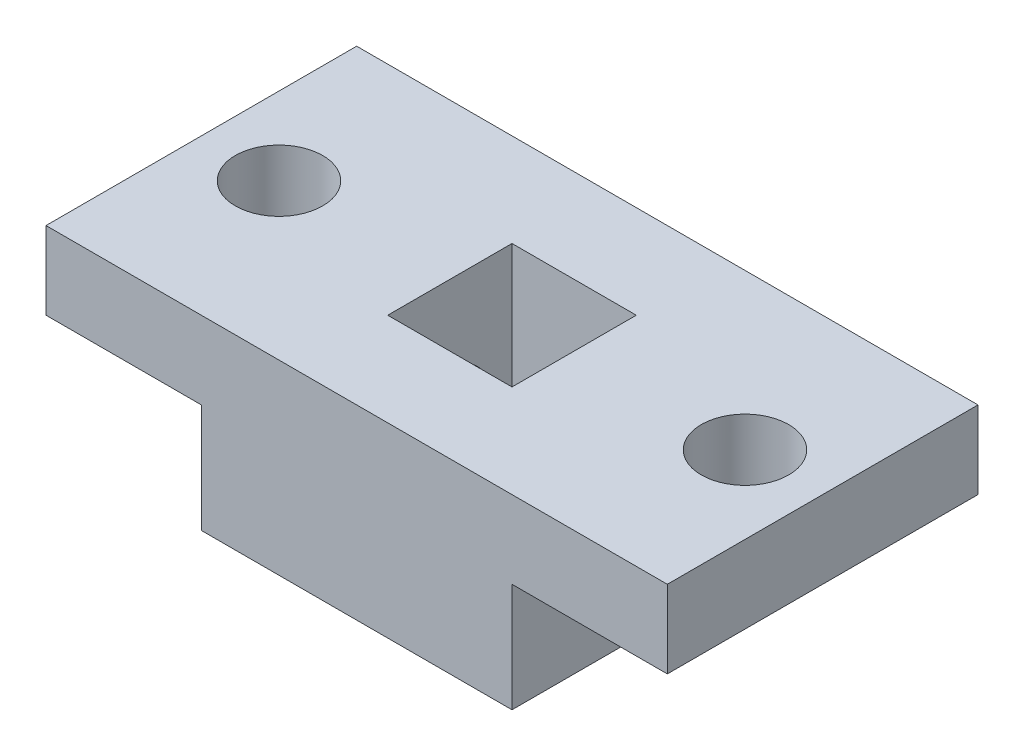
ISO-10303-21;
HEADER;
FILE_DESCRIPTION(('STEP AP214'),'2;1');
FILE_NAME('part.step','',(''),(''),'','','');
FILE_SCHEMA(('AUTOMOTIVE_DESIGN { 1 0 10303 214 1 1 1 1 }'));
ENDSEC;
DATA;
#1=APPLICATION_CONTEXT('core data for automotive mechanical design processes');
#2=APPLICATION_PROTOCOL_DEFINITION('international standard','automotive_design',2000,#1);
#3=PRODUCT_CONTEXT('',#1,'mechanical');
#4=PRODUCT('Part','Part','',(#3));
#5=PRODUCT_RELATED_PRODUCT_CATEGORY('part','',(#4));
#6=PRODUCT_DEFINITION_FORMATION('','',#4);
#7=PRODUCT_DEFINITION_CONTEXT('part definition',#1,'design');
#8=PRODUCT_DEFINITION('design','',#6,#7);
#9=PRODUCT_DEFINITION_SHAPE('','',#8);
#10=(LENGTH_UNIT() NAMED_UNIT(*) SI_UNIT(.MILLI.,.METRE.));
#11=(NAMED_UNIT(*) PLANE_ANGLE_UNIT() SI_UNIT($,.RADIAN.));
#12=(NAMED_UNIT(*) SI_UNIT($,.STERADIAN.) SOLID_ANGLE_UNIT());
#13=UNCERTAINTY_MEASURE_WITH_UNIT(LENGTH_MEASURE(1.E-05),#10,'distance_accuracy_value','');
#14=(GEOMETRIC_REPRESENTATION_CONTEXT(3) GLOBAL_UNCERTAINTY_ASSIGNED_CONTEXT((#13)) GLOBAL_UNIT_ASSIGNED_CONTEXT((#10,
#11,#12)) REPRESENTATION_CONTEXT('',''));
#15=CARTESIAN_POINT('',(0.,0.,0.));
#16=DIRECTION('',(0.,0.,1.));
#17=DIRECTION('',(1.,0.,0.));
#18=AXIS2_PLACEMENT_3D('',#15,#16,#17);
#19=CARTESIAN_POINT('',(6.35,0.,12.7));
#20=DIRECTION('',(0.,-1.,0.));
#21=DIRECTION('',(1.,0.,0.));
#22=AXIS2_PLACEMENT_3D('',#19,#20,#21);
#23=PLANE('',#22);
#24=DIRECTION('',(-1.,0.,0.));
#25=VECTOR('',#24,1.);
#26=CARTESIAN_POINT('',(6.35,0.,0.));
#27=LINE('',#26,#25);
#28=CARTESIAN_POINT('',(6.35,0.,0.));
#29=VERTEX_POINT('',#28);
#30=CARTESIAN_POINT('',(-6.35,0.,0.));
#31=VERTEX_POINT('',#30);
#32=EDGE_CURVE('E211',#29,#31,#27,.T.);
#33=ORIENTED_EDGE('',*,*,#32,.F.);
#34=DIRECTION('',(0.,0.,-1.));
#35=VECTOR('',#34,1.);
#36=CARTESIAN_POINT('',(6.35,0.,12.7));
#37=LINE('',#36,#35);
#38=CARTESIAN_POINT('',(6.35,0.,12.7));
#39=VERTEX_POINT('',#38);
#40=EDGE_CURVE('E12',#39,#29,#37,.T.);
#41=ORIENTED_EDGE('',*,*,#40,.F.);
#42=DIRECTION('',(-1.,0.,0.));
#43=VECTOR('',#42,1.);
#44=CARTESIAN_POINT('',(6.35,0.,12.7));
#45=LINE('',#44,#43);
#46=CARTESIAN_POINT('',(-6.35,0.,12.7));
#47=VERTEX_POINT('',#46);
#48=EDGE_CURVE('E224',#39,#47,#45,.T.);
#49=ORIENTED_EDGE('',*,*,#48,.T.);
#50=DIRECTION('',(0.,0.,-1.));
#51=VECTOR('',#50,1.);
#52=CARTESIAN_POINT('',(-6.35,0.,12.7));
#53=LINE('',#52,#51);
#54=EDGE_CURVE('E207',#47,#31,#53,.T.);
#55=ORIENTED_EDGE('',*,*,#54,.T.);
#56=EDGE_LOOP('',(#33,#41,#49,#55));
#57=FACE_BOUND('',#56,.T.);
#58=ADVANCED_FACE('F41',(#57),#23,.T.);
#59=CARTESIAN_POINT('',(6.35,4.445,12.7));
#60=DIRECTION('',(1.,0.,0.));
#61=DIRECTION('',(0.,1.,0.));
#62=AXIS2_PLACEMENT_3D('',#59,#60,#61);
#63=PLANE('',#62);
#64=DIRECTION('',(0.,-1.,0.));
#65=VECTOR('',#64,1.);
#66=CARTESIAN_POINT('',(6.35,4.445,0.));
#67=LINE('',#66,#65);
#68=CARTESIAN_POINT('',(6.35,4.445,0.));
#69=VERTEX_POINT('',#68);
#70=EDGE_CURVE('E228',#69,#29,#67,.T.);
#71=ORIENTED_EDGE('',*,*,#70,.F.);
#72=DIRECTION('',(0.,0.,-1.));
#73=VECTOR('',#72,1.);
#74=CARTESIAN_POINT('',(6.35,4.445,12.7));
#75=LINE('',#74,#73);
#76=CARTESIAN_POINT('',(6.35,4.445,12.7));
#77=VERTEX_POINT('',#76);
#78=EDGE_CURVE('E50',#77,#69,#75,.T.);
#79=ORIENTED_EDGE('',*,*,#78,.F.);
#80=DIRECTION('',(0.,-1.,0.));
#81=VECTOR('',#80,1.);
#82=CARTESIAN_POINT('',(6.35,4.445,12.7));
#83=LINE('',#82,#81);
#84=EDGE_CURVE('E240',#77,#39,#83,.T.);
#85=ORIENTED_EDGE('',*,*,#84,.T.);
#86=ORIENTED_EDGE('',*,*,#40,.T.);
#87=EDGE_LOOP('',(#71,#79,#85,#86));
#88=FACE_BOUND('',#87,.T.);
#89=ADVANCED_FACE('F298',(#88),#63,.T.);
#90=CARTESIAN_POINT('',(12.7,4.445,12.7));
#91=DIRECTION('',(0.,-1.,0.));
#92=DIRECTION('',(1.,0.,0.));
#93=AXIS2_PLACEMENT_3D('',#90,#91,#92);
#94=PLANE('',#93);
#95=CARTESIAN_POINT('',(9.525,4.445,6.35));
#96=DIRECTION('',(0.,-1.,0.));
#97=DIRECTION('',(1.,0.,0.));
#98=AXIS2_PLACEMENT_3D('',#95,#96,#97);
#99=CIRCLE('',#98,1.7859375);
#100=CARTESIAN_POINT('',(11.3109375,4.445,6.35));
#101=VERTEX_POINT('',#100);
#102=EDGE_CURVE('E320',#101,#101,#99,.T.);
#103=ORIENTED_EDGE('',*,*,#102,.F.);
#104=EDGE_LOOP('',(#103));
#105=FACE_BOUND('',#104,.T.);
#106=DIRECTION('',(-1.,0.,0.));
#107=VECTOR('',#106,1.);
#108=CARTESIAN_POINT('',(12.7,4.445,0.));
#109=LINE('',#108,#107);
#110=CARTESIAN_POINT('',(12.7,4.445,0.));
#111=VERTEX_POINT('',#110);
#112=EDGE_CURVE('E254',#111,#69,#109,.T.);
#113=ORIENTED_EDGE('',*,*,#112,.F.);
#114=DIRECTION('',(0.,0.,-1.));
#115=VECTOR('',#114,1.);
#116=CARTESIAN_POINT('',(12.7,4.445,12.7));
#117=LINE('',#116,#115);
#118=CARTESIAN_POINT('',(12.7,4.445,12.7));
#119=VERTEX_POINT('',#118);
#120=EDGE_CURVE('E262',#119,#111,#117,.T.);
#121=ORIENTED_EDGE('',*,*,#120,.F.);
#122=DIRECTION('',(-1.,0.,0.));
#123=VECTOR('',#122,1.);
#124=CARTESIAN_POINT('',(12.7,4.445,12.7));
#125=LINE('',#124,#123);
#126=EDGE_CURVE('E236',#119,#77,#125,.T.);
#127=ORIENTED_EDGE('',*,*,#126,.T.);
#128=ORIENTED_EDGE('',*,*,#78,.T.);
#129=EDGE_LOOP('',(#113,#121,#127,#128));
#130=FACE_BOUND('',#129,.T.);
#131=ADVANCED_FACE('F295',(#105,#130),#94,.T.);
#132=CARTESIAN_POINT('',(12.7,7.62,12.7));
#133=DIRECTION('',(1.,0.,0.));
#134=DIRECTION('',(0.,0.,-1.));
#135=AXIS2_PLACEMENT_3D('',#132,#133,#134);
#136=PLANE('',#135);
#137=DIRECTION('',(0.,-1.,0.));
#138=VECTOR('',#137,1.);
#139=CARTESIAN_POINT('',(12.7,7.62,0.));
#140=LINE('',#139,#138);
#141=CARTESIAN_POINT('',(12.7,7.62,0.));
#142=VERTEX_POINT('',#141);
#143=EDGE_CURVE('E250',#142,#111,#140,.T.);
#144=ORIENTED_EDGE('',*,*,#143,.F.);
#145=DIRECTION('',(0.,0.,-1.));
#146=VECTOR('',#145,1.);
#147=CARTESIAN_POINT('',(12.7,7.62,12.7));
#148=LINE('',#147,#146);
#149=CARTESIAN_POINT('',(12.7,7.62,12.7));
#150=VERTEX_POINT('',#149);
#151=EDGE_CURVE('E44',#150,#142,#148,.T.);
#152=ORIENTED_EDGE('',*,*,#151,.F.);
#153=DIRECTION('',(0.,-1.,0.));
#154=VECTOR('',#153,1.);
#155=CARTESIAN_POINT('',(12.7,7.62,12.7));
#156=LINE('',#155,#154);
#157=EDGE_CURVE('E232',#150,#119,#156,.T.);
#158=ORIENTED_EDGE('',*,*,#157,.T.);
#159=ORIENTED_EDGE('',*,*,#120,.T.);
#160=EDGE_LOOP('',(#144,#152,#158,#159));
#161=FACE_BOUND('',#160,.T.);
#162=ADVANCED_FACE('F272',(#161),#136,.T.);
#163=CARTESIAN_POINT('',(0.,7.62,12.7));
#164=DIRECTION('',(0.,1.,0.));
#165=DIRECTION('',(0.,0.,1.));
#166=AXIS2_PLACEMENT_3D('',#163,#164,#165);
#167=PLANE('',#166);
#168=CARTESIAN_POINT('',(9.525,7.62,6.35));
#169=DIRECTION('',(0.,1.,0.));
#170=DIRECTION('',(0.,0.,1.));
#171=AXIS2_PLACEMENT_3D('',#168,#169,#170);
#172=CIRCLE('',#171,1.7859375);
#173=CARTESIAN_POINT('',(9.525,7.62,8.1359375));
#174=VERTEX_POINT('',#173);
#175=EDGE_CURVE('E333',#174,#174,#172,.F.);
#176=ORIENTED_EDGE('',*,*,#175,.T.);
#177=EDGE_LOOP('',(#176));
#178=FACE_BOUND('',#177,.T.);
#179=CARTESIAN_POINT('',(-9.525,7.62,6.35));
#180=DIRECTION('',(0.,1.,0.));
#181=DIRECTION('',(0.,0.,1.));
#182=AXIS2_PLACEMENT_3D('',#179,#180,#181);
#183=CIRCLE('',#182,1.7859375);
#184=CARTESIAN_POINT('',(-9.525,7.62,8.1359375));
#185=VERTEX_POINT('',#184);
#186=EDGE_CURVE('E325',#185,#185,#183,.F.);
#187=ORIENTED_EDGE('',*,*,#186,.T.);
#188=EDGE_LOOP('',(#187));
#189=FACE_BOUND('',#188,.T.);
#190=DIRECTION('',(0.,0.,-1.));
#191=VECTOR('',#190,1.);
#192=CARTESIAN_POINT('',(2.54,7.62,8.89));
#193=LINE('',#192,#191);
#194=CARTESIAN_POINT('',(2.54,7.62,8.89));
#195=VERTEX_POINT('',#194);
#196=CARTESIAN_POINT('',(2.54,7.62,3.81));
#197=VERTEX_POINT('',#196);
#198=EDGE_CURVE('E152',#195,#197,#193,.T.);
#199=ORIENTED_EDGE('',*,*,#198,.F.);
#200=DIRECTION('',(1.,0.,0.));
#201=VECTOR('',#200,1.);
#202=CARTESIAN_POINT('',(-2.54,7.62,8.89));
#203=LINE('',#202,#201);
#204=CARTESIAN_POINT('',(-2.54,7.62,8.89));
#205=VERTEX_POINT('',#204);
#206=EDGE_CURVE('E168',#205,#195,#203,.T.);
#207=ORIENTED_EDGE('',*,*,#206,.F.);
#208=DIRECTION('',(0.,0.,1.));
#209=VECTOR('',#208,1.);
#210=CARTESIAN_POINT('',(-2.54,7.62,3.81));
#211=LINE('',#210,#209);
#212=CARTESIAN_POINT('',(-2.54,7.62,3.81));
#213=VERTEX_POINT('',#212);
#214=EDGE_CURVE('E161',#213,#205,#211,.T.);
#215=ORIENTED_EDGE('',*,*,#214,.F.);
#216=DIRECTION('',(-1.,0.,0.));
#217=VECTOR('',#216,1.);
#218=CARTESIAN_POINT('',(2.54,7.62,3.81));
#219=LINE('',#218,#217);
#220=EDGE_CURVE('E164',#197,#213,#219,.T.);
#221=ORIENTED_EDGE('',*,*,#220,.F.);
#222=EDGE_LOOP('',(#199,#207,#215,#221));
#223=FACE_BOUND('',#222,.T.);
#224=DIRECTION('',(1.,0.,0.));
#225=VECTOR('',#224,1.);
#226=CARTESIAN_POINT('',(0.,7.62,0.));
#227=LINE('',#226,#225);
#228=CARTESIAN_POINT('',(-12.7,7.62,0.));
#229=VERTEX_POINT('',#228);
#230=EDGE_CURVE('E246',#229,#142,#227,.T.);
#231=ORIENTED_EDGE('',*,*,#230,.F.);
#232=DIRECTION('',(0.,0.,-1.));
#233=VECTOR('',#232,1.);
#234=CARTESIAN_POINT('',(-12.7,7.62,12.7));
#235=LINE('',#234,#233);
#236=CARTESIAN_POINT('',(-12.7,7.62,12.7));
#237=VERTEX_POINT('',#236);
#238=EDGE_CURVE('E197',#237,#229,#235,.T.);
#239=ORIENTED_EDGE('',*,*,#238,.F.);
#240=DIRECTION('',(1.,0.,0.));
#241=VECTOR('',#240,1.);
#242=CARTESIAN_POINT('',(0.,7.62,12.7));
#243=LINE('',#242,#241);
#244=EDGE_CURVE('E227',#237,#150,#243,.T.);
#245=ORIENTED_EDGE('',*,*,#244,.T.);
#246=ORIENTED_EDGE('',*,*,#151,.T.);
#247=EDGE_LOOP('',(#231,#239,#245,#246));
#248=FACE_BOUND('',#247,.T.);
#249=ADVANCED_FACE('F269',(#178,#189,#223,#248),#167,.T.);
#250=CARTESIAN_POINT('',(0.,0.,12.7));
#251=DIRECTION('',(0.,0.,-1.));
#252=DIRECTION('',(-1.,0.,0.));
#253=AXIS2_PLACEMENT_3D('',#250,#251,#252);
#254=PLANE('',#253);
#255=ORIENTED_EDGE('',*,*,#48,.F.);
#256=ORIENTED_EDGE('',*,*,#84,.F.);
#257=ORIENTED_EDGE('',*,*,#126,.F.);
#258=ORIENTED_EDGE('',*,*,#157,.F.);
#259=ORIENTED_EDGE('',*,*,#244,.F.);
#260=DIRECTION('',(0.,-1.,0.));
#261=VECTOR('',#260,1.);
#262=CARTESIAN_POINT('',(-12.7,7.62,12.7));
#263=LINE('',#262,#261);
#264=CARTESIAN_POINT('',(-12.7,4.445,12.7));
#265=VERTEX_POINT('',#264);
#266=EDGE_CURVE('E186',#237,#265,#263,.T.);
#267=ORIENTED_EDGE('',*,*,#266,.T.);
#268=DIRECTION('',(1.,0.,0.));
#269=VECTOR('',#268,1.);
#270=CARTESIAN_POINT('',(-12.7,4.445,12.7));
#271=LINE('',#270,#269);
#272=CARTESIAN_POINT('',(-6.35,4.445,12.7));
#273=VERTEX_POINT('',#272);
#274=EDGE_CURVE('E189',#265,#273,#271,.T.);
#275=ORIENTED_EDGE('',*,*,#274,.T.);
#276=DIRECTION('',(0.,-1.,0.));
#277=VECTOR('',#276,1.);
#278=CARTESIAN_POINT('',(-6.35,4.445,12.7));
#279=LINE('',#278,#277);
#280=EDGE_CURVE('E193',#273,#47,#279,.T.);
#281=ORIENTED_EDGE('',*,*,#280,.T.);
#282=EDGE_LOOP('',(#255,#256,#257,#258,#259,#267,#275,#281));
#283=FACE_BOUND('',#282,.T.);
#284=ADVANCED_FACE('F290',(#283),#254,.F.);
#285=CARTESIAN_POINT('',(0.,0.,0.));
#286=DIRECTION('',(0.,0.,-1.));
#287=DIRECTION('',(-1.,0.,0.));
#288=AXIS2_PLACEMENT_3D('',#285,#286,#287);
#289=PLANE('',#288);
#290=ORIENTED_EDGE('',*,*,#32,.T.);
#291=DIRECTION('',(0.,-1.,0.));
#292=VECTOR('',#291,1.);
#293=CARTESIAN_POINT('',(-6.35,4.445,0.));
#294=LINE('',#293,#292);
#295=CARTESIAN_POINT('',(-6.35,4.445,0.));
#296=VERTEX_POINT('',#295);
#297=EDGE_CURVE('E190',#296,#31,#294,.T.);
#298=ORIENTED_EDGE('',*,*,#297,.F.);
#299=DIRECTION('',(1.,0.,0.));
#300=VECTOR('',#299,1.);
#301=CARTESIAN_POINT('',(-12.7,4.445,0.));
#302=LINE('',#301,#300);
#303=CARTESIAN_POINT('',(-12.7,4.445,0.));
#304=VERTEX_POINT('',#303);
#305=EDGE_CURVE('E200',#304,#296,#302,.T.);
#306=ORIENTED_EDGE('',*,*,#305,.F.);
#307=DIRECTION('',(0.,-1.,0.));
#308=VECTOR('',#307,1.);
#309=CARTESIAN_POINT('',(-12.7,7.62,0.));
#310=LINE('',#309,#308);
#311=EDGE_CURVE('E185',#229,#304,#310,.T.);
#312=ORIENTED_EDGE('',*,*,#311,.F.);
#313=ORIENTED_EDGE('',*,*,#230,.T.);
#314=ORIENTED_EDGE('',*,*,#143,.T.);
#315=ORIENTED_EDGE('',*,*,#112,.T.);
#316=ORIENTED_EDGE('',*,*,#70,.T.);
#317=EDGE_LOOP('',(#290,#298,#306,#312,#313,#314,#315,#316));
#318=FACE_BOUND('',#317,.T.);
#319=ADVANCED_FACE('F275',(#318),#289,.T.);
#320=CARTESIAN_POINT('',(-6.35,4.445,12.7));
#321=DIRECTION('',(-1.,0.,0.));
#322=DIRECTION('',(0.,1.,0.));
#323=AXIS2_PLACEMENT_3D('',#320,#321,#322);
#324=PLANE('',#323);
#325=DIRECTION('',(0.,0.,-1.));
#326=VECTOR('',#325,1.);
#327=CARTESIAN_POINT('',(-6.35,4.445,12.7));
#328=LINE('',#327,#326);
#329=CARTESIAN_POINT('',(-6.35,4.445,6.35));
#330=VERTEX_POINT('',#329);
#331=EDGE_CURVE('E212',#273,#330,#328,.T.);
#332=ORIENTED_EDGE('',*,*,#331,.T.);
#333=CARTESIAN_POINT('',(-6.35,2.8575,6.35));
#334=DIRECTION('',(-1.,0.,0.));
#335=DIRECTION('',(0.,-1.,0.));
#336=AXIS2_PLACEMENT_3D('',#333,#334,#335);
#337=CIRCLE('',#336,1.5875);
#338=EDGE_CURVE('E56',#330,#330,#337,.T.);
#339=ORIENTED_EDGE('',*,*,#338,.F.);
#340=EDGE_CURVE('E216',#330,#296,#328,.T.);
#341=ORIENTED_EDGE('',*,*,#340,.T.);
#342=ORIENTED_EDGE('',*,*,#297,.T.);
#343=ORIENTED_EDGE('',*,*,#54,.F.);
#344=ORIENTED_EDGE('',*,*,#280,.F.);
#345=EDGE_LOOP('',(#332,#339,#341,#342,#343,#344));
#346=FACE_BOUND('',#345,.T.);
#347=ADVANCED_FACE('F302',(#346),#324,.T.);
#348=CARTESIAN_POINT('',(-12.7,4.445,12.7));
#349=DIRECTION('',(0.,-1.,0.));
#350=DIRECTION('',(-1.,0.,0.));
#351=AXIS2_PLACEMENT_3D('',#348,#349,#350);
#352=PLANE('',#351);
#353=CARTESIAN_POINT('',(-9.525,4.44499999999999,6.35));
#354=DIRECTION('',(0.,-1.,0.));
#355=DIRECTION('',(1.,0.,0.));
#356=AXIS2_PLACEMENT_3D('',#353,#354,#355);
#357=CIRCLE('',#356,1.7859375);
#358=CARTESIAN_POINT('',(-7.7390625,4.44499999999999,6.35));
#359=VERTEX_POINT('',#358);
#360=EDGE_CURVE('E329',#359,#359,#357,.T.);
#361=ORIENTED_EDGE('',*,*,#360,.F.);
#362=EDGE_LOOP('',(#361));
#363=FACE_BOUND('',#362,.T.);
#364=ORIENTED_EDGE('',*,*,#305,.T.);
#365=ORIENTED_EDGE('',*,*,#340,.F.);
#366=ORIENTED_EDGE('',*,*,#331,.F.);
#367=ORIENTED_EDGE('',*,*,#274,.F.);
#368=DIRECTION('',(0.,0.,-1.));
#369=VECTOR('',#368,1.);
#370=CARTESIAN_POINT('',(-12.7,4.445,12.7));
#371=LINE('',#370,#369);
#372=EDGE_CURVE('E217',#265,#304,#371,.T.);
#373=ORIENTED_EDGE('',*,*,#372,.T.);
#374=EDGE_LOOP('',(#364,#365,#366,#367,#373));
#375=FACE_BOUND('',#374,.T.);
#376=ADVANCED_FACE('F284',(#363,#375),#352,.T.);
#377=CARTESIAN_POINT('',(-12.7,7.62,12.7));
#378=DIRECTION('',(-1.,0.,0.));
#379=DIRECTION('',(0.,0.,-1.));
#380=AXIS2_PLACEMENT_3D('',#377,#378,#379);
#381=PLANE('',#380);
#382=ORIENTED_EDGE('',*,*,#311,.T.);
#383=ORIENTED_EDGE('',*,*,#372,.F.);
#384=ORIENTED_EDGE('',*,*,#266,.F.);
#385=ORIENTED_EDGE('',*,*,#238,.T.);
#386=EDGE_LOOP('',(#382,#383,#384,#385));
#387=FACE_BOUND('',#386,.T.);
#388=ADVANCED_FACE('F280',(#387),#381,.T.);
#389=CARTESIAN_POINT('',(6.35,1.27,12.7));
#390=DIRECTION('',(0.,-1.,0.));
#391=DIRECTION('',(1.,0.,0.));
#392=AXIS2_PLACEMENT_3D('',#389,#390,#391);
#393=PLANE('',#392);
#394=DIRECTION('',(1.,0.,0.));
#395=VECTOR('',#394,1.);
#396=CARTESIAN_POINT('',(-2.54,1.27,8.89));
#397=LINE('',#396,#395);
#398=CARTESIAN_POINT('',(-2.54,1.27,8.89));
#399=VERTEX_POINT('',#398);
#400=CARTESIAN_POINT('',(2.54,1.27,8.89));
#401=VERTEX_POINT('',#400);
#402=EDGE_CURVE('E158',#399,#401,#397,.T.);
#403=ORIENTED_EDGE('',*,*,#402,.T.);
#404=DIRECTION('',(0.,0.,-1.));
#405=VECTOR('',#404,1.);
#406=CARTESIAN_POINT('',(2.54,1.27,8.89));
#407=LINE('',#406,#405);
#408=CARTESIAN_POINT('',(2.54,1.27,3.81));
#409=VERTEX_POINT('',#408);
#410=EDGE_CURVE('E149',#401,#409,#407,.T.);
#411=ORIENTED_EDGE('',*,*,#410,.T.);
#412=DIRECTION('',(-1.,0.,0.));
#413=VECTOR('',#412,1.);
#414=CARTESIAN_POINT('',(2.54,1.27,3.81));
#415=LINE('',#414,#413);
#416=CARTESIAN_POINT('',(-2.54,1.27,3.81));
#417=VERTEX_POINT('',#416);
#418=EDGE_CURVE('E135',#409,#417,#415,.T.);
#419=ORIENTED_EDGE('',*,*,#418,.T.);
#420=DIRECTION('',(0.,0.,1.));
#421=VECTOR('',#420,1.);
#422=CARTESIAN_POINT('',(-2.54,1.27,3.81));
#423=LINE('',#422,#421);
#424=CARTESIAN_POINT('',(-2.54,1.27,6.35));
#425=VERTEX_POINT('',#424);
#426=EDGE_CURVE('E174',#417,#425,#423,.T.);
#427=ORIENTED_EDGE('',*,*,#426,.T.);
#428=EDGE_CURVE('E176',#425,#399,#423,.T.);
#429=ORIENTED_EDGE('',*,*,#428,.T.);
#430=EDGE_LOOP('',(#403,#411,#419,#427,#429));
#431=FACE_BOUND('',#430,.T.);
#432=ADVANCED_FACE('F156',(#431),#393,.F.);
#433=CARTESIAN_POINT('',(2.54,-7.18420489685532,8.89));
#434=DIRECTION('',(1.,0.,0.));
#435=DIRECTION('',(0.,0.,-1.));
#436=AXIS2_PLACEMENT_3D('',#433,#434,#435);
#437=PLANE('',#436);
#438=DIRECTION('',(0.,1.,0.));
#439=VECTOR('',#438,1.);
#440=CARTESIAN_POINT('',(2.54,-7.18420489685532,8.89));
#441=LINE('',#440,#439);
#442=EDGE_CURVE('E172',#401,#195,#441,.T.);
#443=ORIENTED_EDGE('',*,*,#442,.T.);
#444=ORIENTED_EDGE('',*,*,#198,.T.);
#445=DIRECTION('',(0.,1.,0.));
#446=VECTOR('',#445,1.);
#447=CARTESIAN_POINT('',(2.54,-7.18420489685532,3.81));
#448=LINE('',#447,#446);
#449=EDGE_CURVE('E139',#409,#197,#448,.T.);
#450=ORIENTED_EDGE('',*,*,#449,.F.);
#451=ORIENTED_EDGE('',*,*,#410,.F.);
#452=EDGE_LOOP('',(#443,#444,#450,#451));
#453=FACE_BOUND('',#452,.T.);
#454=ADVANCED_FACE('F148',(#453),#437,.F.);
#455=CARTESIAN_POINT('',(2.54,-7.18420489685532,3.81));
#456=DIRECTION('',(0.,0.,-1.));
#457=DIRECTION('',(-1.,0.,0.));
#458=AXIS2_PLACEMENT_3D('',#455,#456,#457);
#459=PLANE('',#458);
#460=ORIENTED_EDGE('',*,*,#449,.T.);
#461=ORIENTED_EDGE('',*,*,#220,.T.);
#462=DIRECTION('',(0.,1.,0.));
#463=VECTOR('',#462,1.);
#464=CARTESIAN_POINT('',(-2.54,-7.18420489685532,3.81));
#465=LINE('',#464,#463);
#466=EDGE_CURVE('E141',#417,#213,#465,.T.);
#467=ORIENTED_EDGE('',*,*,#466,.F.);
#468=ORIENTED_EDGE('',*,*,#418,.F.);
#469=EDGE_LOOP('',(#460,#461,#467,#468));
#470=FACE_BOUND('',#469,.T.);
#471=ADVANCED_FACE('F137',(#470),#459,.F.);
#472=CARTESIAN_POINT('',(-2.54,-7.18420489685532,3.81));
#473=DIRECTION('',(-1.,0.,0.));
#474=DIRECTION('',(0.,0.,1.));
#475=AXIS2_PLACEMENT_3D('',#472,#473,#474);
#476=PLANE('',#475);
#477=ORIENTED_EDGE('',*,*,#428,.F.);
#478=CARTESIAN_POINT('',(-2.54,2.8575,6.35));
#479=DIRECTION('',(-1.,0.,0.));
#480=DIRECTION('',(0.,0.,1.));
#481=AXIS2_PLACEMENT_3D('',#478,#479,#480);
#482=CIRCLE('',#481,1.5875);
#483=EDGE_CURVE('E61',#425,#425,#482,.F.);
#484=ORIENTED_EDGE('',*,*,#483,.F.);
#485=ORIENTED_EDGE('',*,*,#426,.F.);
#486=ORIENTED_EDGE('',*,*,#466,.T.);
#487=ORIENTED_EDGE('',*,*,#214,.T.);
#488=DIRECTION('',(0.,1.,0.));
#489=VECTOR('',#488,1.);
#490=CARTESIAN_POINT('',(-2.54,-7.18420489685532,8.89));
#491=LINE('',#490,#489);
#492=EDGE_CURVE('E173',#399,#205,#491,.T.);
#493=ORIENTED_EDGE('',*,*,#492,.F.);
#494=EDGE_LOOP('',(#477,#484,#485,#486,#487,#493));
#495=FACE_BOUND('',#494,.T.);
#496=ADVANCED_FACE('F312',(#495),#476,.F.);
#497=CARTESIAN_POINT('',(-2.54,-7.18420489685532,8.89));
#498=DIRECTION('',(0.,0.,1.));
#499=DIRECTION('',(1.,0.,0.));
#500=AXIS2_PLACEMENT_3D('',#497,#498,#499);
#501=PLANE('',#500);
#502=ORIENTED_EDGE('',*,*,#492,.T.);
#503=ORIENTED_EDGE('',*,*,#206,.T.);
#504=ORIENTED_EDGE('',*,*,#442,.F.);
#505=ORIENTED_EDGE('',*,*,#402,.F.);
#506=EDGE_LOOP('',(#502,#503,#504,#505));
#507=FACE_BOUND('',#506,.T.);
#508=ADVANCED_FACE('F309',(#507),#501,.F.);
#509=CARTESIAN_POINT('',(1.95012806053458,2.8575,6.35));
#510=DIRECTION('',(-1.,0.,0.));
#511=DIRECTION('',(0.,-1.,0.));
#512=AXIS2_PLACEMENT_3D('',#509,#510,#511);
#513=CYLINDRICAL_SURFACE('',#512,1.5875);
#514=ORIENTED_EDGE('',*,*,#483,.T.);
#515=EDGE_LOOP('',(#514));
#516=FACE_BOUND('',#515,.T.);
#517=ORIENTED_EDGE('',*,*,#338,.T.);
#518=EDGE_LOOP('',(#517));
#519=FACE_BOUND('',#518,.T.);
#520=ADVANCED_FACE('F463',(#516,#519),#513,.F.);
#521=CARTESIAN_POINT('',(-9.525,7.621,6.35));
#522=DIRECTION('',(0.,-1.,0.));
#523=DIRECTION('',(1.,0.,0.));
#524=AXIS2_PLACEMENT_3D('',#521,#522,#523);
#525=CYLINDRICAL_SURFACE('',#524,1.7859375);
#526=ORIENTED_EDGE('',*,*,#186,.F.);
#527=EDGE_LOOP('',(#526));
#528=FACE_BOUND('',#527,.T.);
#529=ORIENTED_EDGE('',*,*,#360,.T.);
#530=EDGE_LOOP('',(#529));
#531=FACE_BOUND('',#530,.T.);
#532=ADVANCED_FACE('F470',(#528,#531),#525,.F.);
#533=CARTESIAN_POINT('',(9.525,7.621,6.35));
#534=DIRECTION('',(0.,-1.,0.));
#535=DIRECTION('',(1.,0.,0.));
#536=AXIS2_PLACEMENT_3D('',#533,#534,#535);
#537=CYLINDRICAL_SURFACE('',#536,1.7859375);
#538=ORIENTED_EDGE('',*,*,#175,.F.);
#539=EDGE_LOOP('',(#538));
#540=FACE_BOUND('',#539,.T.);
#541=ORIENTED_EDGE('',*,*,#102,.T.);
#542=EDGE_LOOP('',(#541));
#543=FACE_BOUND('',#542,.T.);
#544=ADVANCED_FACE('F341',(#540,#543),#537,.F.);
#545=CLOSED_SHELL('',(#58,#89,#131,#162,#249,#284,#319,#347,#376,#388,#432,#454,#471,#496,#508,
#520,#532,#544));
#546=MANIFOLD_SOLID_BREP('B2',#545);
#547=ADVANCED_BREP_SHAPE_REPRESENTATION('',(#18,#546),#14);
#548=SHAPE_DEFINITION_REPRESENTATION(#9,#547);
ENDSEC;
END-ISO-10303-21;
